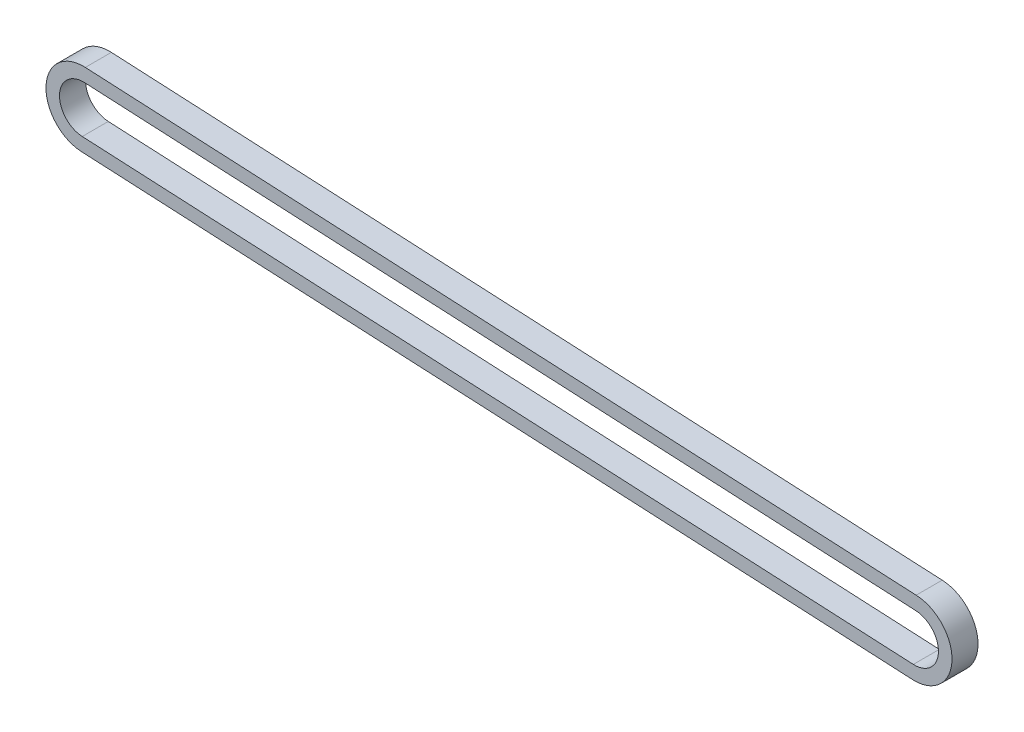
ISO-10303-21;
HEADER;
FILE_DESCRIPTION(('STEP AP214'),'2;1');
FILE_NAME('part.step','',(''),(''),'','','');
FILE_SCHEMA(('AUTOMOTIVE_DESIGN { 1 0 10303 214 1 1 1 1 }'));
ENDSEC;
DATA;
#1=APPLICATION_CONTEXT('core data for automotive mechanical design processes');
#2=APPLICATION_PROTOCOL_DEFINITION('international standard','automotive_design',2000,#1);
#3=PRODUCT_CONTEXT('',#1,'mechanical');
#4=PRODUCT('Part','Part','',(#3));
#5=PRODUCT_RELATED_PRODUCT_CATEGORY('part','',(#4));
#6=PRODUCT_DEFINITION_FORMATION('','',#4);
#7=PRODUCT_DEFINITION_CONTEXT('part definition',#1,'design');
#8=PRODUCT_DEFINITION('design','',#6,#7);
#9=PRODUCT_DEFINITION_SHAPE('','',#8);
#10=(LENGTH_UNIT() NAMED_UNIT(*) SI_UNIT(.MILLI.,.METRE.));
#11=(NAMED_UNIT(*) PLANE_ANGLE_UNIT() SI_UNIT($,.RADIAN.));
#12=(NAMED_UNIT(*) SI_UNIT($,.STERADIAN.) SOLID_ANGLE_UNIT());
#13=UNCERTAINTY_MEASURE_WITH_UNIT(LENGTH_MEASURE(1.E-05),#10,'distance_accuracy_value','');
#14=(GEOMETRIC_REPRESENTATION_CONTEXT(3) GLOBAL_UNCERTAINTY_ASSIGNED_CONTEXT((#13)) GLOBAL_UNIT_ASSIGNED_CONTEXT((#10,
#11,#12)) REPRESENTATION_CONTEXT('',''));
#15=CARTESIAN_POINT('',(0.,0.,0.));
#16=DIRECTION('',(0.,0.,1.));
#17=DIRECTION('',(1.,0.,0.));
#18=AXIS2_PLACEMENT_3D('',#15,#16,#17);
#19=CARTESIAN_POINT('',(0.,0.,3.175));
#20=DIRECTION('',(0.,0.,1.));
#21=DIRECTION('',(1.,0.,0.));
#22=AXIS2_PLACEMENT_3D('',#19,#20,#21);
#23=PLANE('',#22);
#24=CARTESIAN_POINT('',(0.,0.,3.175));
#25=DIRECTION('',(0.,0.,1.));
#26=DIRECTION('',(1.,0.,0.));
#27=AXIS2_PLACEMENT_3D('',#24,#25,#26);
#28=CIRCLE('',#27,4.572);
#29=CARTESIAN_POINT('',(-0.228885569840967,-4.56626711832746,3.175));
#30=VERTEX_POINT('',#29);
#31=CARTESIAN_POINT('',(0.201062712925716,4.56757679579347,3.175));
#32=VERTEX_POINT('',#31);
#33=EDGE_CURVE('E153',#30,#32,#28,.T.);
#34=ORIENTED_EDGE('',*,*,#33,.T.);
#35=DIRECTION('',(-0.998746047002152,0.050063295912018,0.));
#36=VECTOR('',#35,1.);
#37=CARTESIAN_POINT('',(0.201062712925716,4.56757679579347,3.175));
#38=LINE('',#37,#36);
#39=CARTESIAN_POINT('',(-101.11711061109,9.64626692689384,3.175));
#40=VERTEX_POINT('',#39);
#41=EDGE_CURVE('E157',#32,#40,#38,.T.);
#42=ORIENTED_EDGE('',*,*,#41,.T.);
#43=CARTESIAN_POINT('',(-101.346,5.08,3.175));
#44=DIRECTION('',(0.,0.,1.));
#45=DIRECTION('',(1.,0.,0.));
#46=AXIS2_PLACEMENT_3D('',#43,#44,#45);
#47=CIRCLE('',#46,4.572);
#48=CARTESIAN_POINT('',(-101.574885569841,0.513732881672541,3.175));
#49=VERTEX_POINT('',#48);
#50=EDGE_CURVE('E161',#40,#49,#47,.T.);
#51=ORIENTED_EDGE('',*,*,#50,.T.);
#52=DIRECTION('',(0.998746088873023,-0.050062460595139,0.));
#53=VECTOR('',#52,1.);
#54=CARTESIAN_POINT('',(-101.574885569841,0.513732881672543,3.175));
#55=LINE('',#54,#53);
#56=EDGE_CURVE('E164',#49,#30,#55,.T.);
#57=ORIENTED_EDGE('',*,*,#56,.T.);
#58=EDGE_LOOP('',(#34,#42,#51,#57));
#59=FACE_BOUND('',#58,.T.);
#60=DIRECTION('',(0.998746088873023,-0.050062460595139,0.));
#61=VECTOR('',#60,1.);
#62=CARTESIAN_POINT('',(-101.492232447398,2.1626626744019,3.175));
#63=LINE('',#62,#61);
#64=CARTESIAN_POINT('',(-101.492232447398,2.1626626744019,3.175));
#65=VERTEX_POINT('',#64);
#66=CARTESIAN_POINT('',(-0.146232447398401,-2.9173373255981,3.175));
#67=VERTEX_POINT('',#66);
#68=EDGE_CURVE('E114',#65,#67,#63,.T.);
#69=ORIENTED_EDGE('',*,*,#68,.F.);
#70=CARTESIAN_POINT('',(-101.346,5.08,3.175));
#71=DIRECTION('',(0.,0.,1.));
#72=DIRECTION('',(1.,0.,0.));
#73=AXIS2_PLACEMENT_3D('',#70,#71,#72);
#74=CIRCLE('',#73,2.921);
#75=CARTESIAN_POINT('',(-101.199765112641,7.99733720329328,3.175));
#76=VERTEX_POINT('',#75);
#77=EDGE_CURVE('E105',#76,#65,#74,.T.);
#78=ORIENTED_EDGE('',*,*,#77,.F.);
#79=DIRECTION('',(-0.998746047002153,0.050063295912018,0.));
#80=VECTOR('',#79,1.);
#81=CARTESIAN_POINT('',(0.123992084665522,2.918367174113,3.175));
#82=LINE('',#81,#80);
#83=CARTESIAN_POINT('',(0.123992084665524,2.918367174113,3.175));
#84=VERTEX_POINT('',#83);
#85=EDGE_CURVE('E131',#84,#76,#82,.T.);
#86=ORIENTED_EDGE('',*,*,#85,.F.);
#87=CARTESIAN_POINT('',(0.,0.,3.175));
#88=DIRECTION('',(0.,0.,1.));
#89=DIRECTION('',(1.,0.,0.));
#90=AXIS2_PLACEMENT_3D('',#87,#88,#89);
#91=CIRCLE('',#90,2.921);
#92=EDGE_CURVE('E127',#67,#84,#91,.T.);
#93=ORIENTED_EDGE('',*,*,#92,.F.);
#94=EDGE_LOOP('',(#69,#78,#86,#93));
#95=FACE_BOUND('',#94,.T.);
#96=ADVANCED_FACE('F39',(#59,#95),#23,.T.);
#97=CARTESIAN_POINT('',(0.,0.,0.));
#98=DIRECTION('',(0.,0.,1.));
#99=DIRECTION('',(1.,0.,0.));
#100=AXIS2_PLACEMENT_3D('',#97,#98,#99);
#101=PLANE('',#100);
#102=CARTESIAN_POINT('',(0.,0.,0.));
#103=DIRECTION('',(0.,0.,1.));
#104=DIRECTION('',(1.,0.,0.));
#105=AXIS2_PLACEMENT_3D('',#102,#103,#104);
#106=CIRCLE('',#105,4.572);
#107=CARTESIAN_POINT('',(-0.228885569840967,-4.56626711832746,0.));
#108=VERTEX_POINT('',#107);
#109=CARTESIAN_POINT('',(0.201062712925716,4.56757679579347,0.));
#110=VERTEX_POINT('',#109);
#111=EDGE_CURVE('E123',#108,#110,#106,.T.);
#112=ORIENTED_EDGE('',*,*,#111,.F.);
#113=DIRECTION('',(0.998746088873023,-0.050062460595139,0.));
#114=VECTOR('',#113,1.);
#115=CARTESIAN_POINT('',(-101.574885569841,0.513732881672543,0.));
#116=LINE('',#115,#114);
#117=CARTESIAN_POINT('',(-101.574885569841,0.513732881672541,0.));
#118=VERTEX_POINT('',#117);
#119=EDGE_CURVE('E158',#118,#108,#116,.T.);
#120=ORIENTED_EDGE('',*,*,#119,.F.);
#121=CARTESIAN_POINT('',(-101.346,5.08,0.));
#122=DIRECTION('',(0.,0.,1.));
#123=DIRECTION('',(1.,0.,0.));
#124=AXIS2_PLACEMENT_3D('',#121,#122,#123);
#125=CIRCLE('',#124,4.572);
#126=CARTESIAN_POINT('',(-101.11711061109,9.64626692689384,0.));
#127=VERTEX_POINT('',#126);
#128=EDGE_CURVE('E174',#127,#118,#125,.T.);
#129=ORIENTED_EDGE('',*,*,#128,.F.);
#130=DIRECTION('',(-0.998746047002152,0.050063295912018,0.));
#131=VECTOR('',#130,1.);
#132=CARTESIAN_POINT('',(0.201062712925716,4.56757679579347,0.));
#133=LINE('',#132,#131);
#134=EDGE_CURVE('E171',#110,#127,#133,.T.);
#135=ORIENTED_EDGE('',*,*,#134,.F.);
#136=EDGE_LOOP('',(#112,#120,#129,#135));
#137=FACE_BOUND('',#136,.T.);
#138=CARTESIAN_POINT('',(-101.346,5.08,0.));
#139=DIRECTION('',(0.,0.,1.));
#140=DIRECTION('',(1.,0.,0.));
#141=AXIS2_PLACEMENT_3D('',#138,#139,#140);
#142=CIRCLE('',#141,2.921);
#143=CARTESIAN_POINT('',(-101.199765112641,7.99733720329328,0.));
#144=VERTEX_POINT('',#143);
#145=CARTESIAN_POINT('',(-101.492232447398,2.1626626744019,0.));
#146=VERTEX_POINT('',#145);
#147=EDGE_CURVE('E63',#144,#146,#142,.T.);
#148=ORIENTED_EDGE('',*,*,#147,.T.);
#149=DIRECTION('',(0.998746088873023,-0.050062460595139,0.));
#150=VECTOR('',#149,1.);
#151=CARTESIAN_POINT('',(-101.492232447398,2.1626626744019,0.));
#152=LINE('',#151,#150);
#153=CARTESIAN_POINT('',(-0.146232447398401,-2.9173373255981,0.));
#154=VERTEX_POINT('',#153);
#155=EDGE_CURVE('E121',#146,#154,#152,.T.);
#156=ORIENTED_EDGE('',*,*,#155,.T.);
#157=CARTESIAN_POINT('',(0.,0.,0.));
#158=DIRECTION('',(0.,0.,1.));
#159=DIRECTION('',(1.,0.,0.));
#160=AXIS2_PLACEMENT_3D('',#157,#158,#159);
#161=CIRCLE('',#160,2.921);
#162=CARTESIAN_POINT('',(0.123992084665524,2.918367174113,0.));
#163=VERTEX_POINT('',#162);
#164=EDGE_CURVE('E140',#154,#163,#161,.T.);
#165=ORIENTED_EDGE('',*,*,#164,.T.);
#166=DIRECTION('',(-0.998746047002153,0.050063295912018,0.));
#167=VECTOR('',#166,1.);
#168=CARTESIAN_POINT('',(0.123992084665522,2.918367174113,0.));
#169=LINE('',#168,#167);
#170=EDGE_CURVE('E115',#163,#144,#169,.T.);
#171=ORIENTED_EDGE('',*,*,#170,.T.);
#172=EDGE_LOOP('',(#148,#156,#165,#171));
#173=FACE_BOUND('',#172,.T.);
#174=ADVANCED_FACE('F197',(#137,#173),#101,.F.);
#175=CARTESIAN_POINT('',(0.,0.,3.175));
#176=DIRECTION('',(0.,0.,-1.));
#177=DIRECTION('',(-1.,0.,0.));
#178=AXIS2_PLACEMENT_3D('',#175,#176,#177);
#179=CYLINDRICAL_SURFACE('',#178,4.572);
#180=ORIENTED_EDGE('',*,*,#111,.T.);
#181=DIRECTION('',(0.,0.,-1.));
#182=VECTOR('',#181,1.);
#183=CARTESIAN_POINT('',(0.201062712925716,4.56757679579347,3.175));
#184=LINE('',#183,#182);
#185=EDGE_CURVE('E11',#32,#110,#184,.T.);
#186=ORIENTED_EDGE('',*,*,#185,.F.);
#187=ORIENTED_EDGE('',*,*,#33,.F.);
#188=DIRECTION('',(0.,0.,-1.));
#189=VECTOR('',#188,1.);
#190=CARTESIAN_POINT('',(-0.228885569840967,-4.56626711832746,3.175));
#191=LINE('',#190,#189);
#192=EDGE_CURVE('E167',#30,#108,#191,.T.);
#193=ORIENTED_EDGE('',*,*,#192,.T.);
#194=EDGE_LOOP('',(#180,#186,#187,#193));
#195=FACE_BOUND('',#194,.T.);
#196=ADVANCED_FACE('F41',(#195),#179,.T.);
#197=CARTESIAN_POINT('',(0.201062712925716,4.56757679579347,3.175));
#198=DIRECTION('',(-0.050063295912018,-0.998746047002152,0.));
#199=DIRECTION('',(0.998746047002153,-0.050063295912018,0.));
#200=AXIS2_PLACEMENT_3D('',#197,#198,#199);
#201=PLANE('',#200);
#202=ORIENTED_EDGE('',*,*,#134,.T.);
#203=DIRECTION('',(0.,0.,-1.));
#204=VECTOR('',#203,1.);
#205=CARTESIAN_POINT('',(-101.11711061109,9.64626692689384,3.175));
#206=LINE('',#205,#204);
#207=EDGE_CURVE('E48',#40,#127,#206,.T.);
#208=ORIENTED_EDGE('',*,*,#207,.F.);
#209=ORIENTED_EDGE('',*,*,#41,.F.);
#210=ORIENTED_EDGE('',*,*,#185,.T.);
#211=EDGE_LOOP('',(#202,#208,#209,#210));
#212=FACE_BOUND('',#211,.T.);
#213=ADVANCED_FACE('F207',(#212),#201,.F.);
#214=CARTESIAN_POINT('',(-101.346,5.08,3.175));
#215=DIRECTION('',(0.,0.,-1.));
#216=DIRECTION('',(-1.,0.,0.));
#217=AXIS2_PLACEMENT_3D('',#214,#215,#216);
#218=CYLINDRICAL_SURFACE('',#217,4.572);
#219=ORIENTED_EDGE('',*,*,#128,.T.);
#220=DIRECTION('',(0.,0.,-1.));
#221=VECTOR('',#220,1.);
#222=CARTESIAN_POINT('',(-101.574885569841,0.513732881672541,3.175));
#223=LINE('',#222,#221);
#224=EDGE_CURVE('E182',#49,#118,#223,.T.);
#225=ORIENTED_EDGE('',*,*,#224,.F.);
#226=ORIENTED_EDGE('',*,*,#50,.F.);
#227=ORIENTED_EDGE('',*,*,#207,.T.);
#228=EDGE_LOOP('',(#219,#225,#226,#227));
#229=FACE_BOUND('',#228,.T.);
#230=ADVANCED_FACE('F191',(#229),#218,.T.);
#231=CARTESIAN_POINT('',(-101.574885569841,0.513732881672543,3.175));
#232=DIRECTION('',(0.050062460595139,0.998746088873023,0.));
#233=DIRECTION('',(-0.998746088873023,0.050062460595139,0.));
#234=AXIS2_PLACEMENT_3D('',#231,#232,#233);
#235=PLANE('',#234);
#236=ORIENTED_EDGE('',*,*,#119,.T.);
#237=ORIENTED_EDGE('',*,*,#192,.F.);
#238=ORIENTED_EDGE('',*,*,#56,.F.);
#239=ORIENTED_EDGE('',*,*,#224,.T.);
#240=EDGE_LOOP('',(#236,#237,#238,#239));
#241=FACE_BOUND('',#240,.T.);
#242=ADVANCED_FACE('F201',(#241),#235,.F.);
#243=CARTESIAN_POINT('',(-101.346,5.08,3.175));
#244=DIRECTION('',(0.,0.,-1.));
#245=DIRECTION('',(-1.,0.,0.));
#246=AXIS2_PLACEMENT_3D('',#243,#244,#245);
#247=CYLINDRICAL_SURFACE('',#246,2.921);
#248=ORIENTED_EDGE('',*,*,#147,.F.);
#249=DIRECTION('',(0.,0.,-1.));
#250=VECTOR('',#249,1.);
#251=CARTESIAN_POINT('',(-101.199765112641,7.99733720329328,3.175));
#252=LINE('',#251,#250);
#253=EDGE_CURVE('E109',#76,#144,#252,.T.);
#254=ORIENTED_EDGE('',*,*,#253,.F.);
#255=ORIENTED_EDGE('',*,*,#77,.T.);
#256=DIRECTION('',(0.,0.,-1.));
#257=VECTOR('',#256,1.);
#258=CARTESIAN_POINT('',(-101.492232447398,2.1626626744019,3.175));
#259=LINE('',#258,#257);
#260=EDGE_CURVE('E108',#65,#146,#259,.T.);
#261=ORIENTED_EDGE('',*,*,#260,.T.);
#262=EDGE_LOOP('',(#248,#254,#255,#261));
#263=FACE_BOUND('',#262,.T.);
#264=ADVANCED_FACE('F107',(#263),#247,.F.);
#265=CARTESIAN_POINT('',(-101.492232447398,2.1626626744019,3.175));
#266=DIRECTION('',(0.050062460595139,0.998746088873023,0.));
#267=DIRECTION('',(-0.998746088873023,0.050062460595139,0.));
#268=AXIS2_PLACEMENT_3D('',#265,#266,#267);
#269=PLANE('',#268);
#270=ORIENTED_EDGE('',*,*,#155,.F.);
#271=ORIENTED_EDGE('',*,*,#260,.F.);
#272=ORIENTED_EDGE('',*,*,#68,.T.);
#273=DIRECTION('',(0.,0.,-1.));
#274=VECTOR('',#273,1.);
#275=CARTESIAN_POINT('',(-0.146232447398401,-2.9173373255981,3.175));
#276=LINE('',#275,#274);
#277=EDGE_CURVE('E124',#67,#154,#276,.T.);
#278=ORIENTED_EDGE('',*,*,#277,.T.);
#279=EDGE_LOOP('',(#270,#271,#272,#278));
#280=FACE_BOUND('',#279,.T.);
#281=ADVANCED_FACE('F118',(#280),#269,.T.);
#282=CARTESIAN_POINT('',(0.,0.,3.175));
#283=DIRECTION('',(0.,0.,-1.));
#284=DIRECTION('',(-1.,0.,0.));
#285=AXIS2_PLACEMENT_3D('',#282,#283,#284);
#286=CYLINDRICAL_SURFACE('',#285,2.921);
#287=ORIENTED_EDGE('',*,*,#164,.F.);
#288=ORIENTED_EDGE('',*,*,#277,.F.);
#289=ORIENTED_EDGE('',*,*,#92,.T.);
#290=DIRECTION('',(0.,0.,-1.));
#291=VECTOR('',#290,1.);
#292=CARTESIAN_POINT('',(0.123992084665524,2.918367174113,3.175));
#293=LINE('',#292,#291);
#294=EDGE_CURVE('E55',#84,#163,#293,.T.);
#295=ORIENTED_EDGE('',*,*,#294,.T.);
#296=EDGE_LOOP('',(#287,#288,#289,#295));
#297=FACE_BOUND('',#296,.T.);
#298=ADVANCED_FACE('F230',(#297),#286,.F.);
#299=CARTESIAN_POINT('',(0.123992084665522,2.918367174113,3.175));
#300=DIRECTION('',(-0.050063295912018,-0.998746047002152,0.));
#301=DIRECTION('',(0.998746047002153,-0.050063295912018,0.));
#302=AXIS2_PLACEMENT_3D('',#299,#300,#301);
#303=PLANE('',#302);
#304=ORIENTED_EDGE('',*,*,#170,.F.);
#305=ORIENTED_EDGE('',*,*,#294,.F.);
#306=ORIENTED_EDGE('',*,*,#85,.T.);
#307=ORIENTED_EDGE('',*,*,#253,.T.);
#308=EDGE_LOOP('',(#304,#305,#306,#307));
#309=FACE_BOUND('',#308,.T.);
#310=ADVANCED_FACE('F234',(#309),#303,.T.);
#311=CLOSED_SHELL('',(#96,#174,#196,#213,#230,#242,#264,#281,#298,#310));
#312=MANIFOLD_SOLID_BREP('B2',#311);
#313=ADVANCED_BREP_SHAPE_REPRESENTATION('',(#18,#312),#14);
#314=SHAPE_DEFINITION_REPRESENTATION(#9,#313);
ENDSEC;
END-ISO-10303-21;
